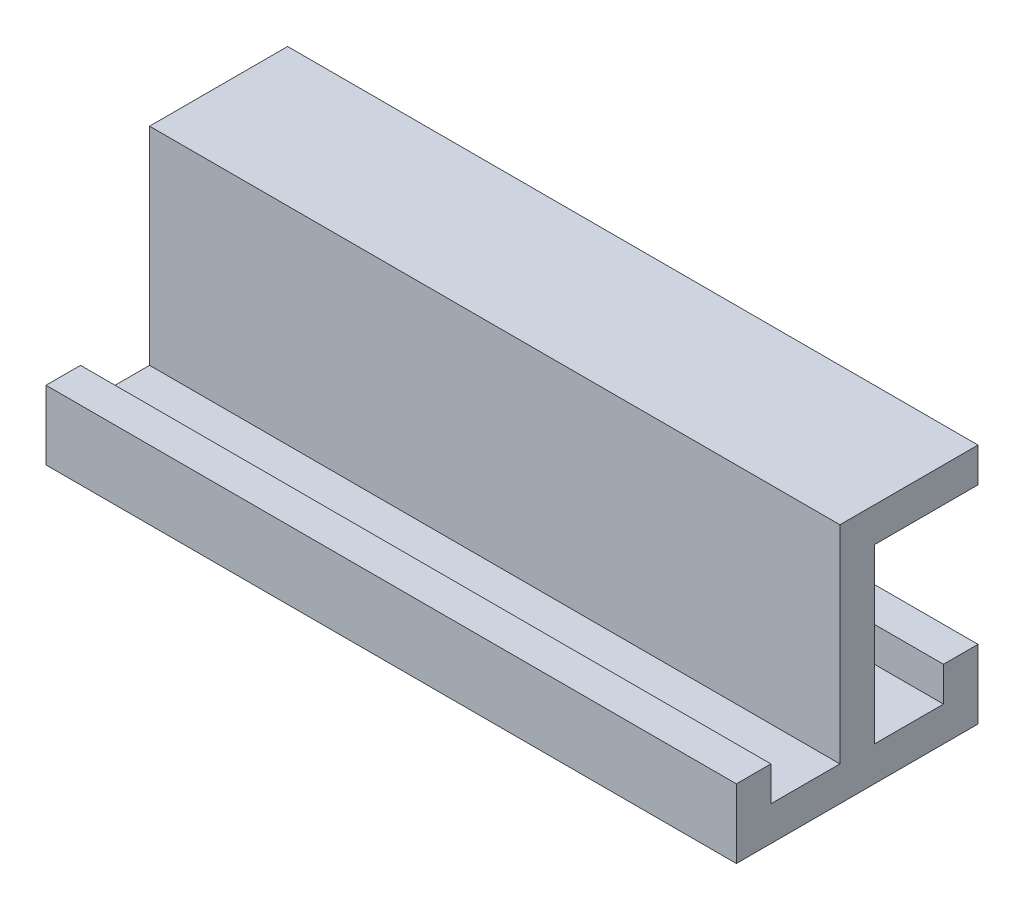
ISO-10303-21;
HEADER;
FILE_DESCRIPTION(('STEP AP214'),'2;1');
FILE_NAME('part.step','',(''),(''),'','','');
FILE_SCHEMA(('AUTOMOTIVE_DESIGN { 1 0 10303 214 1 1 1 1 }'));
ENDSEC;
DATA;
#1=APPLICATION_CONTEXT('core data for automotive mechanical design processes');
#2=APPLICATION_PROTOCOL_DEFINITION('international standard','automotive_design',2000,#1);
#3=PRODUCT_CONTEXT('',#1,'mechanical');
#4=PRODUCT('Part','Part','',(#3));
#5=PRODUCT_RELATED_PRODUCT_CATEGORY('part','',(#4));
#6=PRODUCT_DEFINITION_FORMATION('','',#4);
#7=PRODUCT_DEFINITION_CONTEXT('part definition',#1,'design');
#8=PRODUCT_DEFINITION('design','',#6,#7);
#9=PRODUCT_DEFINITION_SHAPE('','',#8);
#10=(LENGTH_UNIT() NAMED_UNIT(*) SI_UNIT(.MILLI.,.METRE.));
#11=(NAMED_UNIT(*) PLANE_ANGLE_UNIT() SI_UNIT($,.RADIAN.));
#12=(NAMED_UNIT(*) SI_UNIT($,.STERADIAN.) SOLID_ANGLE_UNIT());
#13=UNCERTAINTY_MEASURE_WITH_UNIT(LENGTH_MEASURE(1.E-05),#10,'distance_accuracy_value','');
#14=(GEOMETRIC_REPRESENTATION_CONTEXT(3) GLOBAL_UNCERTAINTY_ASSIGNED_CONTEXT((#13)) GLOBAL_UNIT_ASSIGNED_CONTEXT((#10,
#11,#12)) REPRESENTATION_CONTEXT('',''));
#15=CARTESIAN_POINT('',(0.,0.,0.));
#16=DIRECTION('',(0.,0.,1.));
#17=DIRECTION('',(1.,0.,0.));
#18=AXIS2_PLACEMENT_3D('',#15,#16,#17);
#19=CARTESIAN_POINT('',(100.,0.,-5.));
#20=DIRECTION('',(0.,0.,-1.));
#21=DIRECTION('',(0.,1.,0.));
#22=AXIS2_PLACEMENT_3D('',#19,#20,#21);
#23=PLANE('',#22);
#24=DIRECTION('',(0.,-1.,0.));
#25=VECTOR('',#24,1.);
#26=CARTESIAN_POINT('',(-100.,0.,-5.));
#27=LINE('',#26,#25);
#28=CARTESIAN_POINT('',(-100.,55.,-5.));
#29=VERTEX_POINT('',#28);
#30=CARTESIAN_POINT('',(-100.,5.,-5.));
#31=VERTEX_POINT('',#30);
#32=EDGE_CURVE('E168',#29,#31,#27,.T.);
#33=ORIENTED_EDGE('',*,*,#32,.F.);
#34=DIRECTION('',(-1.,0.,0.));
#35=VECTOR('',#34,1.);
#36=CARTESIAN_POINT('',(100.,55.,-5.));
#37=LINE('',#36,#35);
#38=CARTESIAN_POINT('',(100.,55.,-5.));
#39=VERTEX_POINT('',#38);
#40=EDGE_CURVE('E11',#39,#29,#37,.T.);
#41=ORIENTED_EDGE('',*,*,#40,.F.);
#42=DIRECTION('',(0.,-1.,0.));
#43=VECTOR('',#42,1.);
#44=CARTESIAN_POINT('',(100.,0.,-5.));
#45=LINE('',#44,#43);
#46=CARTESIAN_POINT('',(100.,5.,-5.));
#47=VERTEX_POINT('',#46);
#48=EDGE_CURVE('E245',#39,#47,#45,.T.);
#49=ORIENTED_EDGE('',*,*,#48,.T.);
#50=DIRECTION('',(-1.,0.,0.));
#51=VECTOR('',#50,1.);
#52=CARTESIAN_POINT('',(100.,5.,-5.));
#53=LINE('',#52,#51);
#54=EDGE_CURVE('E53',#47,#31,#53,.T.);
#55=ORIENTED_EDGE('',*,*,#54,.T.);
#56=EDGE_LOOP('',(#33,#41,#49,#55));
#57=FACE_BOUND('',#56,.T.);
#58=ADVANCED_FACE('F37',(#57),#23,.T.);
#59=CARTESIAN_POINT('',(100.,55.,0.));
#60=DIRECTION('',(0.,1.,0.));
#61=DIRECTION('',(0.,0.,1.));
#62=AXIS2_PLACEMENT_3D('',#59,#60,#61);
#63=PLANE('',#62);
#64=DIRECTION('',(0.,0.,-1.));
#65=VECTOR('',#64,1.);
#66=CARTESIAN_POINT('',(-100.,55.,0.));
#67=LINE('',#66,#65);
#68=CARTESIAN_POINT('',(-100.,55.,-35.));
#69=VERTEX_POINT('',#68);
#70=EDGE_CURVE('E170',#29,#69,#67,.T.);
#71=ORIENTED_EDGE('',*,*,#70,.T.);
#72=DIRECTION('',(-1.,0.,0.));
#73=VECTOR('',#72,1.);
#74=CARTESIAN_POINT('',(100.,55.,-35.));
#75=LINE('',#74,#73);
#76=CARTESIAN_POINT('',(100.,55.,-35.));
#77=VERTEX_POINT('',#76);
#78=EDGE_CURVE('E45',#77,#69,#75,.T.);
#79=ORIENTED_EDGE('',*,*,#78,.F.);
#80=DIRECTION('',(0.,0.,-1.));
#81=VECTOR('',#80,1.);
#82=CARTESIAN_POINT('',(100.,55.,0.));
#83=LINE('',#82,#81);
#84=EDGE_CURVE('E241',#39,#77,#83,.T.);
#85=ORIENTED_EDGE('',*,*,#84,.F.);
#86=ORIENTED_EDGE('',*,*,#40,.T.);
#87=EDGE_LOOP('',(#71,#79,#85,#86));
#88=FACE_BOUND('',#87,.T.);
#89=ADVANCED_FACE('F230',(#88),#63,.F.);
#90=CARTESIAN_POINT('',(100.,0.,-35.));
#91=DIRECTION('',(0.,0.,-1.));
#92=DIRECTION('',(-1.,0.,0.));
#93=AXIS2_PLACEMENT_3D('',#90,#91,#92);
#94=PLANE('',#93);
#95=DIRECTION('',(0.,-1.,0.));
#96=VECTOR('',#95,1.);
#97=CARTESIAN_POINT('',(-100.,0.,-35.));
#98=LINE('',#97,#96);
#99=CARTESIAN_POINT('',(-100.,65.,-35.));
#100=VERTEX_POINT('',#99);
#101=EDGE_CURVE('E173',#100,#69,#98,.T.);
#102=ORIENTED_EDGE('',*,*,#101,.F.);
#103=DIRECTION('',(-1.,0.,0.));
#104=VECTOR('',#103,1.);
#105=CARTESIAN_POINT('',(100.,65.,-35.));
#106=LINE('',#105,#104);
#107=CARTESIAN_POINT('',(100.,65.,-35.));
#108=VERTEX_POINT('',#107);
#109=EDGE_CURVE('E220',#108,#100,#106,.T.);
#110=ORIENTED_EDGE('',*,*,#109,.F.);
#111=DIRECTION('',(0.,-1.,0.));
#112=VECTOR('',#111,1.);
#113=CARTESIAN_POINT('',(100.,0.,-35.));
#114=LINE('',#113,#112);
#115=EDGE_CURVE('E227',#108,#77,#114,.T.);
#116=ORIENTED_EDGE('',*,*,#115,.T.);
#117=ORIENTED_EDGE('',*,*,#78,.T.);
#118=EDGE_LOOP('',(#102,#110,#116,#117));
#119=FACE_BOUND('',#118,.T.);
#120=ADVANCED_FACE('F225',(#119),#94,.T.);
#121=CARTESIAN_POINT('',(100.,65.,0.));
#122=DIRECTION('',(0.,1.,0.));
#123=DIRECTION('',(0.,0.,1.));
#124=AXIS2_PLACEMENT_3D('',#121,#122,#123);
#125=PLANE('',#124);
#126=DIRECTION('',(0.,0.,-1.));
#127=VECTOR('',#126,1.);
#128=CARTESIAN_POINT('',(-100.,65.,0.));
#129=LINE('',#128,#127);
#130=CARTESIAN_POINT('',(-100.,65.,5.));
#131=VERTEX_POINT('',#130);
#132=EDGE_CURVE('E176',#131,#100,#129,.T.);
#133=ORIENTED_EDGE('',*,*,#132,.F.);
#134=DIRECTION('',(-1.,0.,0.));
#135=VECTOR('',#134,1.);
#136=CARTESIAN_POINT('',(100.,65.,5.));
#137=LINE('',#136,#135);
#138=CARTESIAN_POINT('',(100.,65.,5.));
#139=VERTEX_POINT('',#138);
#140=EDGE_CURVE('E218',#139,#131,#137,.T.);
#141=ORIENTED_EDGE('',*,*,#140,.F.);
#142=DIRECTION('',(0.,0.,-1.));
#143=VECTOR('',#142,1.);
#144=CARTESIAN_POINT('',(100.,65.,0.));
#145=LINE('',#144,#143);
#146=EDGE_CURVE('E240',#139,#108,#145,.T.);
#147=ORIENTED_EDGE('',*,*,#146,.T.);
#148=ORIENTED_EDGE('',*,*,#109,.T.);
#149=EDGE_LOOP('',(#133,#141,#147,#148));
#150=FACE_BOUND('',#149,.T.);
#151=ADVANCED_FACE('F236',(#150),#125,.T.);
#152=CARTESIAN_POINT('',(100.,0.,5.));
#153=DIRECTION('',(0.,0.,-1.));
#154=DIRECTION('',(0.,1.,0.));
#155=AXIS2_PLACEMENT_3D('',#152,#153,#154);
#156=PLANE('',#155);
#157=DIRECTION('',(0.,-1.,0.));
#158=VECTOR('',#157,1.);
#159=CARTESIAN_POINT('',(-100.,0.,5.));
#160=LINE('',#159,#158);
#161=CARTESIAN_POINT('',(-100.,5.,5.));
#162=VERTEX_POINT('',#161);
#163=EDGE_CURVE('E179',#131,#162,#160,.T.);
#164=ORIENTED_EDGE('',*,*,#163,.T.);
#165=DIRECTION('',(-1.,0.,0.));
#166=VECTOR('',#165,1.);
#167=CARTESIAN_POINT('',(100.,5.,5.));
#168=LINE('',#167,#166);
#169=CARTESIAN_POINT('',(100.,5.,5.));
#170=VERTEX_POINT('',#169);
#171=EDGE_CURVE('E216',#170,#162,#168,.T.);
#172=ORIENTED_EDGE('',*,*,#171,.F.);
#173=DIRECTION('',(0.,-1.,0.));
#174=VECTOR('',#173,1.);
#175=CARTESIAN_POINT('',(100.,0.,5.));
#176=LINE('',#175,#174);
#177=EDGE_CURVE('E243',#139,#170,#176,.T.);
#178=ORIENTED_EDGE('',*,*,#177,.F.);
#179=ORIENTED_EDGE('',*,*,#140,.T.);
#180=EDGE_LOOP('',(#164,#172,#178,#179));
#181=FACE_BOUND('',#180,.T.);
#182=ADVANCED_FACE('F284',(#181),#156,.F.);
#183=CARTESIAN_POINT('',(100.,5.,0.));
#184=DIRECTION('',(0.,1.,0.));
#185=DIRECTION('',(0.,0.,1.));
#186=AXIS2_PLACEMENT_3D('',#183,#184,#185);
#187=PLANE('',#186);
#188=DIRECTION('',(0.,0.,-1.));
#189=VECTOR('',#188,1.);
#190=CARTESIAN_POINT('',(-100.,5.,0.));
#191=LINE('',#190,#189);
#192=CARTESIAN_POINT('',(-100.,5.,25.));
#193=VERTEX_POINT('',#192);
#194=EDGE_CURVE('E182',#193,#162,#191,.T.);
#195=ORIENTED_EDGE('',*,*,#194,.F.);
#196=DIRECTION('',(-1.,0.,0.));
#197=VECTOR('',#196,1.);
#198=CARTESIAN_POINT('',(100.,5.,25.));
#199=LINE('',#198,#197);
#200=CARTESIAN_POINT('',(100.,5.,25.));
#201=VERTEX_POINT('',#200);
#202=EDGE_CURVE('E214',#201,#193,#199,.T.);
#203=ORIENTED_EDGE('',*,*,#202,.F.);
#204=DIRECTION('',(0.,0.,-1.));
#205=VECTOR('',#204,1.);
#206=CARTESIAN_POINT('',(100.,5.,0.));
#207=LINE('',#206,#205);
#208=EDGE_CURVE('E165',#201,#170,#207,.T.);
#209=ORIENTED_EDGE('',*,*,#208,.T.);
#210=ORIENTED_EDGE('',*,*,#171,.T.);
#211=EDGE_LOOP('',(#195,#203,#209,#210));
#212=FACE_BOUND('',#211,.T.);
#213=ADVANCED_FACE('F274',(#212),#187,.T.);
#214=CARTESIAN_POINT('',(100.,0.,25.));
#215=DIRECTION('',(0.,0.,1.));
#216=DIRECTION('',(1.,0.,0.));
#217=AXIS2_PLACEMENT_3D('',#214,#215,#216);
#218=PLANE('',#217);
#219=DIRECTION('',(0.,1.,0.));
#220=VECTOR('',#219,1.);
#221=CARTESIAN_POINT('',(-100.,0.,25.));
#222=LINE('',#221,#220);
#223=CARTESIAN_POINT('',(-100.,15.,25.));
#224=VERTEX_POINT('',#223);
#225=EDGE_CURVE('E185',#193,#224,#222,.T.);
#226=ORIENTED_EDGE('',*,*,#225,.T.);
#227=DIRECTION('',(-1.,0.,0.));
#228=VECTOR('',#227,1.);
#229=CARTESIAN_POINT('',(100.,15.,25.));
#230=LINE('',#229,#228);
#231=CARTESIAN_POINT('',(100.,15.,25.));
#232=VERTEX_POINT('',#231);
#233=EDGE_CURVE('E212',#232,#224,#230,.T.);
#234=ORIENTED_EDGE('',*,*,#233,.F.);
#235=DIRECTION('',(0.,1.,0.));
#236=VECTOR('',#235,1.);
#237=CARTESIAN_POINT('',(100.,0.,25.));
#238=LINE('',#237,#236);
#239=EDGE_CURVE('E251',#201,#232,#238,.T.);
#240=ORIENTED_EDGE('',*,*,#239,.F.);
#241=ORIENTED_EDGE('',*,*,#202,.T.);
#242=EDGE_LOOP('',(#226,#234,#240,#241));
#243=FACE_BOUND('',#242,.T.);
#244=ADVANCED_FACE('F283',(#243),#218,.F.);
#245=CARTESIAN_POINT('',(100.,15.,0.));
#246=DIRECTION('',(0.,1.,0.));
#247=DIRECTION('',(0.,0.,1.));
#248=AXIS2_PLACEMENT_3D('',#245,#246,#247);
#249=PLANE('',#248);
#250=DIRECTION('',(0.,0.,-1.));
#251=VECTOR('',#250,1.);
#252=CARTESIAN_POINT('',(-100.,15.,0.));
#253=LINE('',#252,#251);
#254=CARTESIAN_POINT('',(-100.,15.,35.));
#255=VERTEX_POINT('',#254);
#256=EDGE_CURVE('E189',#255,#224,#253,.T.);
#257=ORIENTED_EDGE('',*,*,#256,.F.);
#258=DIRECTION('',(-1.,0.,0.));
#259=VECTOR('',#258,1.);
#260=CARTESIAN_POINT('',(100.,15.,35.));
#261=LINE('',#260,#259);
#262=CARTESIAN_POINT('',(100.,15.,35.));
#263=VERTEX_POINT('',#262);
#264=EDGE_CURVE('E210',#263,#255,#261,.T.);
#265=ORIENTED_EDGE('',*,*,#264,.F.);
#266=DIRECTION('',(0.,0.,-1.));
#267=VECTOR('',#266,1.);
#268=CARTESIAN_POINT('',(100.,15.,0.));
#269=LINE('',#268,#267);
#270=EDGE_CURVE('E253',#263,#232,#269,.T.);
#271=ORIENTED_EDGE('',*,*,#270,.T.);
#272=ORIENTED_EDGE('',*,*,#233,.T.);
#273=EDGE_LOOP('',(#257,#265,#271,#272));
#274=FACE_BOUND('',#273,.T.);
#275=ADVANCED_FACE('F302',(#274),#249,.T.);
#276=CARTESIAN_POINT('',(100.,0.,35.));
#277=DIRECTION('',(0.,0.,1.));
#278=DIRECTION('',(1.,0.,0.));
#279=AXIS2_PLACEMENT_3D('',#276,#277,#278);
#280=PLANE('',#279);
#281=DIRECTION('',(0.,1.,0.));
#282=VECTOR('',#281,1.);
#283=CARTESIAN_POINT('',(-100.,0.,35.));
#284=LINE('',#283,#282);
#285=CARTESIAN_POINT('',(-100.,-5.,35.));
#286=VERTEX_POINT('',#285);
#287=EDGE_CURVE('E192',#286,#255,#284,.T.);
#288=ORIENTED_EDGE('',*,*,#287,.F.);
#289=DIRECTION('',(-1.,0.,0.));
#290=VECTOR('',#289,1.);
#291=CARTESIAN_POINT('',(100.,-5.,35.));
#292=LINE('',#291,#290);
#293=CARTESIAN_POINT('',(100.,-5.,35.));
#294=VERTEX_POINT('',#293);
#295=EDGE_CURVE('E208',#294,#286,#292,.T.);
#296=ORIENTED_EDGE('',*,*,#295,.F.);
#297=DIRECTION('',(0.,1.,0.));
#298=VECTOR('',#297,1.);
#299=CARTESIAN_POINT('',(100.,0.,35.));
#300=LINE('',#299,#298);
#301=EDGE_CURVE('E256',#294,#263,#300,.T.);
#302=ORIENTED_EDGE('',*,*,#301,.T.);
#303=ORIENTED_EDGE('',*,*,#264,.T.);
#304=EDGE_LOOP('',(#288,#296,#302,#303));
#305=FACE_BOUND('',#304,.T.);
#306=ADVANCED_FACE('F306',(#305),#280,.T.);
#307=CARTESIAN_POINT('',(100.,-5.,0.));
#308=DIRECTION('',(0.,1.,0.));
#309=DIRECTION('',(0.,0.,1.));
#310=AXIS2_PLACEMENT_3D('',#307,#308,#309);
#311=PLANE('',#310);
#312=DIRECTION('',(0.,0.,-1.));
#313=VECTOR('',#312,1.);
#314=CARTESIAN_POINT('',(-100.,-5.,0.));
#315=LINE('',#314,#313);
#316=CARTESIAN_POINT('',(-100.,-5.,-35.));
#317=VERTEX_POINT('',#316);
#318=EDGE_CURVE('E195',#286,#317,#315,.T.);
#319=ORIENTED_EDGE('',*,*,#318,.T.);
#320=DIRECTION('',(-1.,0.,0.));
#321=VECTOR('',#320,1.);
#322=CARTESIAN_POINT('',(100.,-5.,-35.));
#323=LINE('',#322,#321);
#324=CARTESIAN_POINT('',(100.,-5.,-35.));
#325=VERTEX_POINT('',#324);
#326=EDGE_CURVE('E205',#325,#317,#323,.T.);
#327=ORIENTED_EDGE('',*,*,#326,.F.);
#328=DIRECTION('',(0.,0.,-1.));
#329=VECTOR('',#328,1.);
#330=CARTESIAN_POINT('',(100.,-5.,0.));
#331=LINE('',#330,#329);
#332=EDGE_CURVE('E259',#294,#325,#331,.T.);
#333=ORIENTED_EDGE('',*,*,#332,.F.);
#334=ORIENTED_EDGE('',*,*,#295,.T.);
#335=EDGE_LOOP('',(#319,#327,#333,#334));
#336=FACE_BOUND('',#335,.T.);
#337=ADVANCED_FACE('F265',(#336),#311,.F.);
#338=CARTESIAN_POINT('',(100.,0.,-35.));
#339=DIRECTION('',(0.,0.,1.));
#340=DIRECTION('',(1.,0.,0.));
#341=AXIS2_PLACEMENT_3D('',#338,#339,#340);
#342=PLANE('',#341);
#343=DIRECTION('',(0.,1.,0.));
#344=VECTOR('',#343,1.);
#345=CARTESIAN_POINT('',(-100.,0.,-35.));
#346=LINE('',#345,#344);
#347=CARTESIAN_POINT('',(-100.,15.,-35.));
#348=VERTEX_POINT('',#347);
#349=EDGE_CURVE('E197',#317,#348,#346,.T.);
#350=ORIENTED_EDGE('',*,*,#349,.T.);
#351=DIRECTION('',(-1.,0.,0.));
#352=VECTOR('',#351,1.);
#353=CARTESIAN_POINT('',(100.,15.,-35.));
#354=LINE('',#353,#352);
#355=CARTESIAN_POINT('',(100.,15.,-35.));
#356=VERTEX_POINT('',#355);
#357=EDGE_CURVE('E159',#356,#348,#354,.T.);
#358=ORIENTED_EDGE('',*,*,#357,.F.);
#359=DIRECTION('',(0.,1.,0.));
#360=VECTOR('',#359,1.);
#361=CARTESIAN_POINT('',(100.,0.,-35.));
#362=LINE('',#361,#360);
#363=EDGE_CURVE('E147',#325,#356,#362,.T.);
#364=ORIENTED_EDGE('',*,*,#363,.F.);
#365=ORIENTED_EDGE('',*,*,#326,.T.);
#366=EDGE_LOOP('',(#350,#358,#364,#365));
#367=FACE_BOUND('',#366,.T.);
#368=ADVANCED_FACE('F269',(#367),#342,.F.);
#369=CARTESIAN_POINT('',(100.,15.,0.));
#370=DIRECTION('',(0.,-1.,0.));
#371=DIRECTION('',(0.,0.,-1.));
#372=AXIS2_PLACEMENT_3D('',#369,#370,#371);
#373=PLANE('',#372);
#374=DIRECTION('',(0.,0.,1.));
#375=VECTOR('',#374,1.);
#376=CARTESIAN_POINT('',(-100.,15.,0.));
#377=LINE('',#376,#375);
#378=CARTESIAN_POINT('',(-100.,15.,-25.));
#379=VERTEX_POINT('',#378);
#380=EDGE_CURVE('E156',#348,#379,#377,.T.);
#381=ORIENTED_EDGE('',*,*,#380,.T.);
#382=DIRECTION('',(-1.,0.,0.));
#383=VECTOR('',#382,1.);
#384=CARTESIAN_POINT('',(100.,15.,-25.));
#385=LINE('',#384,#383);
#386=CARTESIAN_POINT('',(100.,15.,-25.));
#387=VERTEX_POINT('',#386);
#388=EDGE_CURVE('E153',#387,#379,#385,.T.);
#389=ORIENTED_EDGE('',*,*,#388,.F.);
#390=DIRECTION('',(0.,0.,1.));
#391=VECTOR('',#390,1.);
#392=CARTESIAN_POINT('',(100.,15.,0.));
#393=LINE('',#392,#391);
#394=EDGE_CURVE('E139',#356,#387,#393,.T.);
#395=ORIENTED_EDGE('',*,*,#394,.F.);
#396=ORIENTED_EDGE('',*,*,#357,.T.);
#397=EDGE_LOOP('',(#381,#389,#395,#396));
#398=FACE_BOUND('',#397,.T.);
#399=ADVANCED_FACE('F154',(#398),#373,.F.);
#400=CARTESIAN_POINT('',(100.,0.,-25.));
#401=DIRECTION('',(0.,0.,1.));
#402=DIRECTION('',(1.,0.,0.));
#403=AXIS2_PLACEMENT_3D('',#400,#401,#402);
#404=PLANE('',#403);
#405=DIRECTION('',(0.,1.,0.));
#406=VECTOR('',#405,1.);
#407=CARTESIAN_POINT('',(-100.,0.,-25.));
#408=LINE('',#407,#406);
#409=CARTESIAN_POINT('',(-100.,5.,-25.));
#410=VERTEX_POINT('',#409);
#411=EDGE_CURVE('E200',#410,#379,#408,.T.);
#412=ORIENTED_EDGE('',*,*,#411,.F.);
#413=DIRECTION('',(-1.,0.,0.));
#414=VECTOR('',#413,1.);
#415=CARTESIAN_POINT('',(100.,5.,-25.));
#416=LINE('',#415,#414);
#417=CARTESIAN_POINT('',(100.,5.,-25.));
#418=VERTEX_POINT('',#417);
#419=EDGE_CURVE('E96',#418,#410,#416,.T.);
#420=ORIENTED_EDGE('',*,*,#419,.F.);
#421=DIRECTION('',(0.,1.,0.));
#422=VECTOR('',#421,1.);
#423=CARTESIAN_POINT('',(100.,0.,-25.));
#424=LINE('',#423,#422);
#425=EDGE_CURVE('E145',#418,#387,#424,.T.);
#426=ORIENTED_EDGE('',*,*,#425,.T.);
#427=ORIENTED_EDGE('',*,*,#388,.T.);
#428=EDGE_LOOP('',(#412,#420,#426,#427));
#429=FACE_BOUND('',#428,.T.);
#430=ADVANCED_FACE('F161',(#429),#404,.T.);
#431=EDGE_CURVE('E186',#31,#410,#191,.T.);
#432=ORIENTED_EDGE('',*,*,#431,.F.);
#433=ORIENTED_EDGE('',*,*,#54,.F.);
#434=EDGE_CURVE('E162',#47,#418,#207,.T.);
#435=ORIENTED_EDGE('',*,*,#434,.T.);
#436=ORIENTED_EDGE('',*,*,#419,.T.);
#437=EDGE_LOOP('',(#432,#433,#435,#436));
#438=FACE_BOUND('',#437,.T.);
#439=ADVANCED_FACE('F271',(#438),#187,.T.);
#440=CARTESIAN_POINT('',(100.,0.,0.));
#441=DIRECTION('',(1.,0.,0.));
#442=DIRECTION('',(0.,0.,-1.));
#443=AXIS2_PLACEMENT_3D('',#440,#441,#442);
#444=PLANE('',#443);
#445=ORIENTED_EDGE('',*,*,#48,.F.);
#446=ORIENTED_EDGE('',*,*,#84,.T.);
#447=ORIENTED_EDGE('',*,*,#115,.F.);
#448=ORIENTED_EDGE('',*,*,#146,.F.);
#449=ORIENTED_EDGE('',*,*,#177,.T.);
#450=ORIENTED_EDGE('',*,*,#208,.F.);
#451=ORIENTED_EDGE('',*,*,#239,.T.);
#452=ORIENTED_EDGE('',*,*,#270,.F.);
#453=ORIENTED_EDGE('',*,*,#301,.F.);
#454=ORIENTED_EDGE('',*,*,#332,.T.);
#455=ORIENTED_EDGE('',*,*,#363,.T.);
#456=ORIENTED_EDGE('',*,*,#394,.T.);
#457=ORIENTED_EDGE('',*,*,#425,.F.);
#458=ORIENTED_EDGE('',*,*,#434,.F.);
#459=EDGE_LOOP('',(#445,#446,#447,#448,#449,#450,#451,#452,#453,#454,#455,#456,#457,#458));
#460=FACE_BOUND('',#459,.T.);
#461=ADVANCED_FACE('F142',(#460),#444,.T.);
#462=CARTESIAN_POINT('',(-100.,0.,0.));
#463=DIRECTION('',(1.,0.,0.));
#464=DIRECTION('',(0.,0.,-1.));
#465=AXIS2_PLACEMENT_3D('',#462,#463,#464);
#466=PLANE('',#465);
#467=ORIENTED_EDGE('',*,*,#32,.T.);
#468=ORIENTED_EDGE('',*,*,#431,.T.);
#469=ORIENTED_EDGE('',*,*,#411,.T.);
#470=ORIENTED_EDGE('',*,*,#380,.F.);
#471=ORIENTED_EDGE('',*,*,#349,.F.);
#472=ORIENTED_EDGE('',*,*,#318,.F.);
#473=ORIENTED_EDGE('',*,*,#287,.T.);
#474=ORIENTED_EDGE('',*,*,#256,.T.);
#475=ORIENTED_EDGE('',*,*,#225,.F.);
#476=ORIENTED_EDGE('',*,*,#194,.T.);
#477=ORIENTED_EDGE('',*,*,#163,.F.);
#478=ORIENTED_EDGE('',*,*,#132,.T.);
#479=ORIENTED_EDGE('',*,*,#101,.T.);
#480=ORIENTED_EDGE('',*,*,#70,.F.);
#481=EDGE_LOOP('',(#467,#468,#469,#470,#471,#472,#473,#474,#475,#476,#477,#478,#479,#480));
#482=FACE_BOUND('',#481,.T.);
#483=ADVANCED_FACE('F232',(#482),#466,.F.);
#484=CLOSED_SHELL('',(#58,#89,#120,#151,#182,#213,#244,#275,#306,#337,#368,#399,#430,#439,#461,#483));
#485=MANIFOLD_SOLID_BREP('B2',#484);
#486=ADVANCED_BREP_SHAPE_REPRESENTATION('',(#18,#485),#14);
#487=SHAPE_DEFINITION_REPRESENTATION(#9,#486);
ENDSEC;
END-ISO-10303-21;
